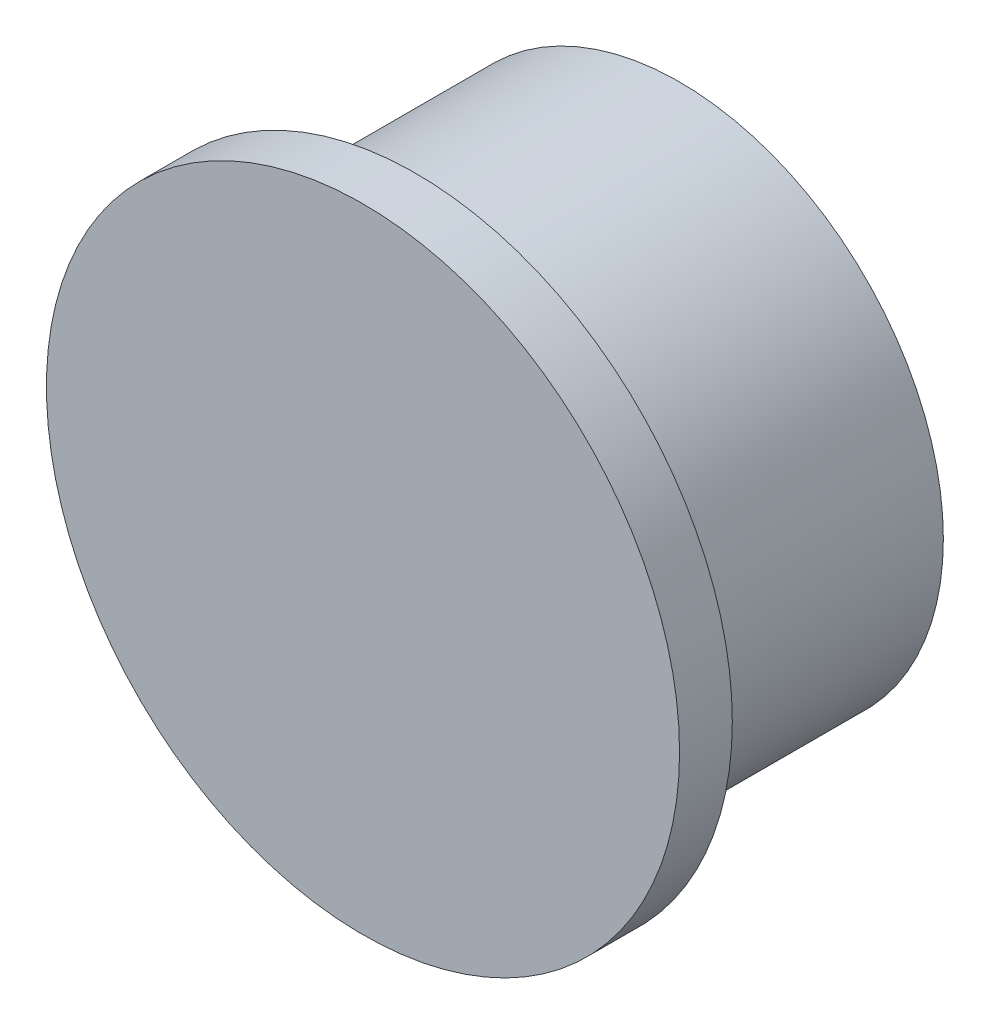
ISO-10303-21;
HEADER;
FILE_DESCRIPTION(('STEP AP214'),'2;1');
FILE_NAME('part.step','',(''),(''),'','','');
FILE_SCHEMA(('AUTOMOTIVE_DESIGN { 1 0 10303 214 1 1 1 1 }'));
ENDSEC;
DATA;
#1=APPLICATION_CONTEXT('core data for automotive mechanical design processes');
#2=APPLICATION_PROTOCOL_DEFINITION('international standard','automotive_design',2000,#1);
#3=PRODUCT_CONTEXT('',#1,'mechanical');
#4=PRODUCT('Part','Part','',(#3));
#5=PRODUCT_RELATED_PRODUCT_CATEGORY('part','',(#4));
#6=PRODUCT_DEFINITION_FORMATION('','',#4);
#7=PRODUCT_DEFINITION_CONTEXT('part definition',#1,'design');
#8=PRODUCT_DEFINITION('design','',#6,#7);
#9=PRODUCT_DEFINITION_SHAPE('','',#8);
#10=(LENGTH_UNIT() NAMED_UNIT(*) SI_UNIT(.MILLI.,.METRE.));
#11=(NAMED_UNIT(*) PLANE_ANGLE_UNIT() SI_UNIT($,.RADIAN.));
#12=(NAMED_UNIT(*) SI_UNIT($,.STERADIAN.) SOLID_ANGLE_UNIT());
#13=UNCERTAINTY_MEASURE_WITH_UNIT(LENGTH_MEASURE(1.E-05),#10,'distance_accuracy_value','');
#14=(GEOMETRIC_REPRESENTATION_CONTEXT(3) GLOBAL_UNCERTAINTY_ASSIGNED_CONTEXT((#13)) GLOBAL_UNIT_ASSIGNED_CONTEXT((#10,
#11,#12)) REPRESENTATION_CONTEXT('',''));
#15=CARTESIAN_POINT('',(0.,0.,0.));
#16=DIRECTION('',(0.,0.,1.));
#17=DIRECTION('',(1.,0.,0.));
#18=AXIS2_PLACEMENT_3D('',#15,#16,#17);
#19=CARTESIAN_POINT('',(-41.1615726148144,8.30698404244554,0.));
#20=DIRECTION('',(0.,0.,1.));
#21=DIRECTION('',(1.,0.,0.));
#22=AXIS2_PLACEMENT_3D('',#19,#20,#21);
#23=PLANE('',#22);
#24=CARTESIAN_POINT('',(-41.1615726148149,-14.1930159575545,0.));
#25=DIRECTION('',(0.,0.,-1.));
#26=DIRECTION('',(-1.,0.,0.));
#27=AXIS2_PLACEMENT_3D('',#24,#25,#26);
#28=CIRCLE('',#27,1.5);
#29=CARTESIAN_POINT('',(-42.6615726148149,-14.1930159575545,0.));
#30=VERTEX_POINT('',#29);
#31=EDGE_CURVE('E72',#30,#30,#28,.T.);
#32=ORIENTED_EDGE('',*,*,#31,.F.);
#33=EDGE_LOOP('',(#32));
#34=FACE_BOUND('',#33,.T.);
#35=CARTESIAN_POINT('',(-18.6615726148147,8.30698404244546,0.));
#36=DIRECTION('',(0.,0.,-1.));
#37=DIRECTION('',(-1.,0.,0.));
#38=AXIS2_PLACEMENT_3D('',#35,#36,#37);
#39=CIRCLE('',#38,1.5);
#40=CARTESIAN_POINT('',(-20.1615726148147,8.30698404244546,0.));
#41=VERTEX_POINT('',#40);
#42=EDGE_CURVE('E69',#41,#41,#39,.T.);
#43=ORIENTED_EDGE('',*,*,#42,.F.);
#44=EDGE_LOOP('',(#43));
#45=FACE_BOUND('',#44,.T.);
#46=CARTESIAN_POINT('',(-41.1615726148144,30.8069840424455,0.));
#47=DIRECTION('',(0.,0.,-1.));
#48=DIRECTION('',(-1.,0.,0.));
#49=AXIS2_PLACEMENT_3D('',#46,#47,#48);
#50=CIRCLE('',#49,1.5);
#51=CARTESIAN_POINT('',(-42.6615726148144,30.8069840424455,0.));
#52=VERTEX_POINT('',#51);
#53=EDGE_CURVE('E63',#52,#52,#50,.T.);
#54=ORIENTED_EDGE('',*,*,#53,.F.);
#55=EDGE_LOOP('',(#54));
#56=FACE_BOUND('',#55,.T.);
#57=CARTESIAN_POINT('',(-63.6615726148147,8.30698404244577,0.));
#58=DIRECTION('',(0.,0.,-1.));
#59=DIRECTION('',(-1.,0.,0.));
#60=AXIS2_PLACEMENT_3D('',#57,#58,#59);
#61=CIRCLE('',#60,1.5);
#62=CARTESIAN_POINT('',(-65.1615726148147,8.30698404244577,0.));
#63=VERTEX_POINT('',#62);
#64=EDGE_CURVE('E57',#63,#63,#61,.T.);
#65=ORIENTED_EDGE('',*,*,#64,.F.);
#66=EDGE_LOOP('',(#65));
#67=FACE_BOUND('',#66,.T.);
#68=CARTESIAN_POINT('',(-41.1615726148144,8.30698404244554,0.));
#69=DIRECTION('',(0.,0.,1.));
#70=DIRECTION('',(1.,0.,0.));
#71=AXIS2_PLACEMENT_3D('',#68,#69,#70);
#72=CIRCLE('',#71,25.);
#73=CARTESIAN_POINT('',(-16.1615726148144,8.30698404244554,0.));
#74=VERTEX_POINT('',#73);
#75=EDGE_CURVE('E38',#74,#74,#72,.T.);
#76=ORIENTED_EDGE('',*,*,#75,.F.);
#77=EDGE_LOOP('',(#76));
#78=FACE_BOUND('',#77,.T.);
#79=CARTESIAN_POINT('',(-41.1615726148144,8.30698404244554,0.));
#80=DIRECTION('',(0.,0.,1.));
#81=DIRECTION('',(1.,0.,0.));
#82=AXIS2_PLACEMENT_3D('',#79,#80,#81);
#83=CIRCLE('',#82,20.);
#84=CARTESIAN_POINT('',(-21.1615726148144,8.30698404244554,0.));
#85=VERTEX_POINT('',#84);
#86=EDGE_CURVE('E45',#85,#85,#83,.T.);
#87=ORIENTED_EDGE('',*,*,#86,.T.);
#88=EDGE_LOOP('',(#87));
#89=FACE_BOUND('',#88,.T.);
#90=ADVANCED_FACE('F34',(#34,#45,#56,#67,#78,#89),#23,.F.);
#91=CARTESIAN_POINT('',(-41.1615726148144,8.30698404244554,25.));
#92=DIRECTION('',(0.,0.,-1.));
#93=DIRECTION('',(-1.,0.,0.));
#94=AXIS2_PLACEMENT_3D('',#91,#92,#93);
#95=CYLINDRICAL_SURFACE('',#94,25.);
#96=CARTESIAN_POINT('',(-41.1615726148144,8.30698404244554,25.));
#97=DIRECTION('',(0.,0.,1.));
#98=DIRECTION('',(1.,0.,0.));
#99=AXIS2_PLACEMENT_3D('',#96,#97,#98);
#100=CIRCLE('',#99,25.);
#101=CARTESIAN_POINT('',(-16.1615726148144,8.30698404244554,25.));
#102=VERTEX_POINT('',#101);
#103=EDGE_CURVE('E10',#102,#102,#100,.T.);
#104=ORIENTED_EDGE('',*,*,#103,.F.);
#105=EDGE_LOOP('',(#104));
#106=FACE_BOUND('',#105,.T.);
#107=ORIENTED_EDGE('',*,*,#75,.T.);
#108=EDGE_LOOP('',(#107));
#109=FACE_BOUND('',#108,.T.);
#110=ADVANCED_FACE('F36',(#106,#109),#95,.T.);
#111=CARTESIAN_POINT('',(-41.1615726148144,8.30698404244554,25.));
#112=DIRECTION('',(0.,0.,-1.));
#113=DIRECTION('',(-1.,0.,0.));
#114=AXIS2_PLACEMENT_3D('',#111,#112,#113);
#115=CYLINDRICAL_SURFACE('',#114,20.);
#116=CARTESIAN_POINT('',(-41.1615726148144,8.30698404244554,25.));
#117=DIRECTION('',(0.,0.,1.));
#118=DIRECTION('',(1.,0.,0.));
#119=AXIS2_PLACEMENT_3D('',#116,#117,#118);
#120=CIRCLE('',#119,20.);
#121=CARTESIAN_POINT('',(-21.1615726148144,8.30698404244554,25.));
#122=VERTEX_POINT('',#121);
#123=EDGE_CURVE('E50',#122,#122,#120,.T.);
#124=ORIENTED_EDGE('',*,*,#123,.T.);
#125=EDGE_LOOP('',(#124));
#126=FACE_BOUND('',#125,.T.);
#127=ORIENTED_EDGE('',*,*,#86,.F.);
#128=EDGE_LOOP('',(#127));
#129=FACE_BOUND('',#128,.T.);
#130=ADVANCED_FACE('F107',(#126,#129),#115,.F.);
#131=CARTESIAN_POINT('',(-63.6615726148147,8.30698404244577,15.));
#132=DIRECTION('',(0.,0.,-1.));
#133=DIRECTION('',(-1.,0.,0.));
#134=AXIS2_PLACEMENT_3D('',#131,#132,#133);
#135=CYLINDRICAL_SURFACE('',#134,1.5);
#136=CARTESIAN_POINT('',(-63.6615726148147,8.30698404244577,15.));
#137=DIRECTION('',(0.,0.,-1.));
#138=DIRECTION('',(-1.,0.,0.));
#139=AXIS2_PLACEMENT_3D('',#136,#137,#138);
#140=CIRCLE('',#139,1.5);
#141=CARTESIAN_POINT('',(-65.1615726148147,8.30698404244577,15.));
#142=VERTEX_POINT('',#141);
#143=EDGE_CURVE('E53',#142,#142,#140,.T.);
#144=CARTESIAN_POINT('',(-65.1615726148147,8.30698404244577,15.));
#145=CARTESIAN_POINT('',(-65.1615726148147,8.30698404244577,14.84375));
#146=CARTESIAN_POINT('',(-65.1615726148147,8.30698404244577,14.6875));
#147=CARTESIAN_POINT('',(-65.1615726148147,8.30698404244577,14.375));
#148=CARTESIAN_POINT('',(-65.1615726148147,8.30698404244577,14.21875));
#149=CARTESIAN_POINT('',(-65.1615726148147,8.30698404244577,13.90625));
#150=CARTESIAN_POINT('',(-65.1615726148147,8.30698404244577,13.75));
#151=CARTESIAN_POINT('',(-65.1615726148147,8.30698404244577,13.4375));
#152=CARTESIAN_POINT('',(-65.1615726148147,8.30698404244577,13.28125));
#153=CARTESIAN_POINT('',(-65.1615726148147,8.30698404244577,12.96875));
#154=CARTESIAN_POINT('',(-65.1615726148147,8.30698404244577,12.8125));
#155=CARTESIAN_POINT('',(-65.1615726148147,8.30698404244577,12.5));
#156=CARTESIAN_POINT('',(-65.1615726148147,8.30698404244577,12.34375));
#157=CARTESIAN_POINT('',(-65.1615726148147,8.30698404244577,12.03125));
#158=CARTESIAN_POINT('',(-65.1615726148147,8.30698404244577,11.875));
#159=CARTESIAN_POINT('',(-65.1615726148147,8.30698404244577,11.5625));
#160=CARTESIAN_POINT('',(-65.1615726148147,8.30698404244577,11.40625));
#161=CARTESIAN_POINT('',(-65.1615726148147,8.30698404244577,11.09375));
#162=CARTESIAN_POINT('',(-65.1615726148147,8.30698404244577,10.9375));
#163=CARTESIAN_POINT('',(-65.1615726148147,8.30698404244577,10.625));
#164=CARTESIAN_POINT('',(-65.1615726148147,8.30698404244577,10.46875));
#165=CARTESIAN_POINT('',(-65.1615726148147,8.30698404244577,10.15625));
#166=CARTESIAN_POINT('',(-65.1615726148147,8.30698404244577,10.));
#167=CARTESIAN_POINT('',(-65.1615726148147,8.30698404244577,9.6875));
#168=CARTESIAN_POINT('',(-65.1615726148147,8.30698404244577,9.53125));
#169=CARTESIAN_POINT('',(-65.1615726148147,8.30698404244577,9.21875));
#170=CARTESIAN_POINT('',(-65.1615726148147,8.30698404244577,9.0625));
#171=CARTESIAN_POINT('',(-65.1615726148147,8.30698404244577,8.75));
#172=CARTESIAN_POINT('',(-65.1615726148147,8.30698404244577,8.59375));
#173=CARTESIAN_POINT('',(-65.1615726148147,8.30698404244577,8.28125));
#174=CARTESIAN_POINT('',(-65.1615726148147,8.30698404244577,8.125));
#175=CARTESIAN_POINT('',(-65.1615726148147,8.30698404244577,7.8125));
#176=CARTESIAN_POINT('',(-65.1615726148147,8.30698404244577,7.65625));
#177=CARTESIAN_POINT('',(-65.1615726148147,8.30698404244577,7.34375));
#178=CARTESIAN_POINT('',(-65.1615726148147,8.30698404244577,7.1875));
#179=CARTESIAN_POINT('',(-65.1615726148147,8.30698404244577,6.875));
#180=CARTESIAN_POINT('',(-65.1615726148147,8.30698404244577,6.71875));
#181=CARTESIAN_POINT('',(-65.1615726148147,8.30698404244577,6.40625));
#182=CARTESIAN_POINT('',(-65.1615726148147,8.30698404244577,6.25));
#183=CARTESIAN_POINT('',(-65.1615726148147,8.30698404244577,5.9375));
#184=CARTESIAN_POINT('',(-65.1615726148147,8.30698404244577,5.78125));
#185=CARTESIAN_POINT('',(-65.1615726148147,8.30698404244577,5.46875));
#186=CARTESIAN_POINT('',(-65.1615726148147,8.30698404244577,5.3125));
#187=CARTESIAN_POINT('',(-65.1615726148147,8.30698404244577,5.));
#188=CARTESIAN_POINT('',(-65.1615726148147,8.30698404244577,4.84375));
#189=CARTESIAN_POINT('',(-65.1615726148147,8.30698404244577,4.53125));
#190=CARTESIAN_POINT('',(-65.1615726148147,8.30698404244577,4.375));
#191=CARTESIAN_POINT('',(-65.1615726148147,8.30698404244577,4.0625));
#192=CARTESIAN_POINT('',(-65.1615726148147,8.30698404244577,3.90625));
#193=CARTESIAN_POINT('',(-65.1615726148147,8.30698404244577,3.59375));
#194=CARTESIAN_POINT('',(-65.1615726148147,8.30698404244577,3.4375));
#195=CARTESIAN_POINT('',(-65.1615726148147,8.30698404244577,3.125));
#196=CARTESIAN_POINT('',(-65.1615726148147,8.30698404244577,2.96875));
#197=CARTESIAN_POINT('',(-65.1615726148147,8.30698404244577,2.65625));
#198=CARTESIAN_POINT('',(-65.1615726148147,8.30698404244577,2.5));
#199=CARTESIAN_POINT('',(-65.1615726148147,8.30698404244577,2.1875));
#200=CARTESIAN_POINT('',(-65.1615726148147,8.30698404244577,2.03125));
#201=CARTESIAN_POINT('',(-65.1615726148147,8.30698404244577,1.71875));
#202=CARTESIAN_POINT('',(-65.1615726148147,8.30698404244577,1.5625));
#203=CARTESIAN_POINT('',(-65.1615726148147,8.30698404244577,1.25));
#204=CARTESIAN_POINT('',(-65.1615726148147,8.30698404244577,1.09375));
#205=CARTESIAN_POINT('',(-65.1615726148147,8.30698404244577,0.781250000000001));
#206=CARTESIAN_POINT('',(-65.1615726148147,8.30698404244577,0.625));
#207=CARTESIAN_POINT('',(-65.1615726148147,8.30698404244577,0.3125));
#208=CARTESIAN_POINT('',(-65.1615726148147,8.30698404244577,0.15625));
#209=CARTESIAN_POINT('',(-65.1615726148147,8.30698404244577,0.));
#210=B_SPLINE_CURVE_WITH_KNOTS('',3,(#144,#145,#146,#147,#148,#149,#150,#151,#152,#153,#154,
#155,#156,#157,#158,#159,#160,#161,#162,#163,#164,#165,#166,#167,#168,#169,#170,#171,#172,#173,
#174,#175,#176,#177,#178,#179,#180,#181,#182,#183,#184,#185,#186,#187,#188,#189,#190,#191,#192,
#193,#194,#195,#196,#197,#198,#199,#200,#201,#202,#203,#204,#205,#206,#207,#208,#209),
.UNSPECIFIED.,.F.,.F.,(4,2,2,2,2,2,2,2,2,2,2,2,2,2,2,2,2,2,2,2,2,2,2,2,2,2,2,2,2,2,2,2,4),(0.,
0.46875,0.937500000000001,1.40625,1.875,2.34375,2.8125,3.28125,3.75,4.21875,4.6875,5.15625,
5.625,6.09375,6.5625,7.03125,7.5,7.96875,8.4375,8.90625,9.375,9.84375,10.3125,10.78125,11.25,
11.71875,12.1875,12.65625,13.125,13.59375,14.0625,14.53125,15.),.UNSPECIFIED.);
#211=EDGE_CURVE('BSEAM114',#142,#63,#210,.T.);
#212=ORIENTED_EDGE('',*,*,#143,.F.);
#213=ORIENTED_EDGE('',*,*,#64,.T.);
#214=ORIENTED_EDGE('',*,*,#211,.T.);
#215=ORIENTED_EDGE('',*,*,#211,.F.);
#216=EDGE_LOOP('',(#212,#214,#213,#215));
#217=FACE_BOUND('',#216,.T.);
#218=ADVANCED_FACE('F114',(#217),#135,.F.);
#219=CARTESIAN_POINT('',(-63.6615726148147,8.30698404244577,15.));
#220=DIRECTION('',(0.,0.,-1.));
#221=DIRECTION('',(-1.,0.,0.));
#222=AXIS2_PLACEMENT_3D('',#219,#220,#221);
#223=PLANE('',#222);
#224=ORIENTED_EDGE('',*,*,#143,.T.);
#225=EDGE_LOOP('',(#224));
#226=FACE_BOUND('',#225,.T.);
#227=ADVANCED_FACE('F116',(#226),#223,.T.);
#228=CARTESIAN_POINT('',(-41.1615726148144,30.8069840424455,15.));
#229=DIRECTION('',(0.,0.,-1.));
#230=DIRECTION('',(-1.,0.,0.));
#231=AXIS2_PLACEMENT_3D('',#228,#229,#230);
#232=CYLINDRICAL_SURFACE('',#231,1.5);
#233=CARTESIAN_POINT('',(-41.1615726148144,30.8069840424455,15.));
#234=DIRECTION('',(0.,0.,-1.));
#235=DIRECTION('',(-1.,0.,0.));
#236=AXIS2_PLACEMENT_3D('',#233,#234,#235);
#237=CIRCLE('',#236,1.5);
#238=CARTESIAN_POINT('',(-42.6615726148144,30.8069840424455,15.));
#239=VERTEX_POINT('',#238);
#240=EDGE_CURVE('E60',#239,#239,#237,.T.);
#241=CARTESIAN_POINT('',(-42.6615726148144,30.8069840424455,15.));
#242=CARTESIAN_POINT('',(-42.6615726148144,30.8069840424455,14.84375));
#243=CARTESIAN_POINT('',(-42.6615726148144,30.8069840424455,14.6875));
#244=CARTESIAN_POINT('',(-42.6615726148144,30.8069840424455,14.375));
#245=CARTESIAN_POINT('',(-42.6615726148144,30.8069840424455,14.21875));
#246=CARTESIAN_POINT('',(-42.6615726148144,30.8069840424455,13.90625));
#247=CARTESIAN_POINT('',(-42.6615726148144,30.8069840424455,13.75));
#248=CARTESIAN_POINT('',(-42.6615726148144,30.8069840424455,13.4375));
#249=CARTESIAN_POINT('',(-42.6615726148144,30.8069840424455,13.28125));
#250=CARTESIAN_POINT('',(-42.6615726148144,30.8069840424455,12.96875));
#251=CARTESIAN_POINT('',(-42.6615726148144,30.8069840424455,12.8125));
#252=CARTESIAN_POINT('',(-42.6615726148144,30.8069840424455,12.5));
#253=CARTESIAN_POINT('',(-42.6615726148144,30.8069840424455,12.34375));
#254=CARTESIAN_POINT('',(-42.6615726148144,30.8069840424455,12.03125));
#255=CARTESIAN_POINT('',(-42.6615726148144,30.8069840424455,11.875));
#256=CARTESIAN_POINT('',(-42.6615726148144,30.8069840424455,11.5625));
#257=CARTESIAN_POINT('',(-42.6615726148144,30.8069840424455,11.40625));
#258=CARTESIAN_POINT('',(-42.6615726148144,30.8069840424455,11.09375));
#259=CARTESIAN_POINT('',(-42.6615726148144,30.8069840424455,10.9375));
#260=CARTESIAN_POINT('',(-42.6615726148144,30.8069840424455,10.625));
#261=CARTESIAN_POINT('',(-42.6615726148144,30.8069840424455,10.46875));
#262=CARTESIAN_POINT('',(-42.6615726148144,30.8069840424455,10.15625));
#263=CARTESIAN_POINT('',(-42.6615726148144,30.8069840424455,10.));
#264=CARTESIAN_POINT('',(-42.6615726148144,30.8069840424455,9.6875));
#265=CARTESIAN_POINT('',(-42.6615726148144,30.8069840424455,9.53125));
#266=CARTESIAN_POINT('',(-42.6615726148144,30.8069840424455,9.21875));
#267=CARTESIAN_POINT('',(-42.6615726148144,30.8069840424455,9.0625));
#268=CARTESIAN_POINT('',(-42.6615726148144,30.8069840424455,8.75));
#269=CARTESIAN_POINT('',(-42.6615726148144,30.8069840424455,8.59375));
#270=CARTESIAN_POINT('',(-42.6615726148144,30.8069840424455,8.28125));
#271=CARTESIAN_POINT('',(-42.6615726148144,30.8069840424455,8.125));
#272=CARTESIAN_POINT('',(-42.6615726148144,30.8069840424455,7.8125));
#273=CARTESIAN_POINT('',(-42.6615726148144,30.8069840424455,7.65625));
#274=CARTESIAN_POINT('',(-42.6615726148144,30.8069840424455,7.34375));
#275=CARTESIAN_POINT('',(-42.6615726148144,30.8069840424455,7.1875));
#276=CARTESIAN_POINT('',(-42.6615726148144,30.8069840424455,6.875));
#277=CARTESIAN_POINT('',(-42.6615726148144,30.8069840424455,6.71875));
#278=CARTESIAN_POINT('',(-42.6615726148144,30.8069840424455,6.40625));
#279=CARTESIAN_POINT('',(-42.6615726148144,30.8069840424455,6.25));
#280=CARTESIAN_POINT('',(-42.6615726148144,30.8069840424455,5.9375));
#281=CARTESIAN_POINT('',(-42.6615726148144,30.8069840424455,5.78125));
#282=CARTESIAN_POINT('',(-42.6615726148144,30.8069840424455,5.46875));
#283=CARTESIAN_POINT('',(-42.6615726148144,30.8069840424455,5.3125));
#284=CARTESIAN_POINT('',(-42.6615726148144,30.8069840424455,5.));
#285=CARTESIAN_POINT('',(-42.6615726148144,30.8069840424455,4.84375));
#286=CARTESIAN_POINT('',(-42.6615726148144,30.8069840424455,4.53125));
#287=CARTESIAN_POINT('',(-42.6615726148144,30.8069840424455,4.375));
#288=CARTESIAN_POINT('',(-42.6615726148144,30.8069840424455,4.0625));
#289=CARTESIAN_POINT('',(-42.6615726148144,30.8069840424455,3.90625));
#290=CARTESIAN_POINT('',(-42.6615726148144,30.8069840424455,3.59375));
#291=CARTESIAN_POINT('',(-42.6615726148144,30.8069840424455,3.4375));
#292=CARTESIAN_POINT('',(-42.6615726148144,30.8069840424455,3.125));
#293=CARTESIAN_POINT('',(-42.6615726148144,30.8069840424455,2.96875));
#294=CARTESIAN_POINT('',(-42.6615726148144,30.8069840424455,2.65625));
#295=CARTESIAN_POINT('',(-42.6615726148144,30.8069840424455,2.5));
#296=CARTESIAN_POINT('',(-42.6615726148144,30.8069840424455,2.1875));
#297=CARTESIAN_POINT('',(-42.6615726148144,30.8069840424455,2.03125));
#298=CARTESIAN_POINT('',(-42.6615726148144,30.8069840424455,1.71875));
#299=CARTESIAN_POINT('',(-42.6615726148144,30.8069840424455,1.5625));
#300=CARTESIAN_POINT('',(-42.6615726148144,30.8069840424455,1.25));
#301=CARTESIAN_POINT('',(-42.6615726148144,30.8069840424455,1.09375));
#302=CARTESIAN_POINT('',(-42.6615726148144,30.8069840424455,0.781250000000001));
#303=CARTESIAN_POINT('',(-42.6615726148144,30.8069840424455,0.625));
#304=CARTESIAN_POINT('',(-42.6615726148144,30.8069840424455,0.3125));
#305=CARTESIAN_POINT('',(-42.6615726148144,30.8069840424455,0.15625));
#306=CARTESIAN_POINT('',(-42.6615726148144,30.8069840424455,0.));
#307=B_SPLINE_CURVE_WITH_KNOTS('',3,(#241,#242,#243,#244,#245,#246,#247,#248,#249,#250,#251,
#252,#253,#254,#255,#256,#257,#258,#259,#260,#261,#262,#263,#264,#265,#266,#267,#268,#269,#270,
#271,#272,#273,#274,#275,#276,#277,#278,#279,#280,#281,#282,#283,#284,#285,#286,#287,#288,#289,
#290,#291,#292,#293,#294,#295,#296,#297,#298,#299,#300,#301,#302,#303,#304,#305,#306),
.UNSPECIFIED.,.F.,.F.,(4,2,2,2,2,2,2,2,2,2,2,2,2,2,2,2,2,2,2,2,2,2,2,2,2,2,2,2,2,2,2,2,4),(0.,
0.46875,0.937500000000001,1.40625,1.875,2.34375,2.8125,3.28125,3.75,4.21875,4.6875,5.15625,
5.625,6.09375,6.5625,7.03125,7.5,7.96875,8.4375,8.90625,9.375,9.84375,10.3125,10.78125,11.25,
11.71875,12.1875,12.65625,13.125,13.59375,14.0625,14.53125,15.),.UNSPECIFIED.);
#308=EDGE_CURVE('BSEAM119',#239,#52,#307,.T.);
#309=ORIENTED_EDGE('',*,*,#240,.F.);
#310=ORIENTED_EDGE('',*,*,#53,.T.);
#311=ORIENTED_EDGE('',*,*,#308,.T.);
#312=ORIENTED_EDGE('',*,*,#308,.F.);
#313=EDGE_LOOP('',(#309,#311,#310,#312));
#314=FACE_BOUND('',#313,.T.);
#315=ADVANCED_FACE('F119',(#314),#232,.F.);
#316=CARTESIAN_POINT('',(-41.1615726148144,30.8069840424455,15.));
#317=DIRECTION('',(0.,0.,-1.));
#318=DIRECTION('',(-1.,0.,0.));
#319=AXIS2_PLACEMENT_3D('',#316,#317,#318);
#320=PLANE('',#319);
#321=ORIENTED_EDGE('',*,*,#240,.T.);
#322=EDGE_LOOP('',(#321));
#323=FACE_BOUND('',#322,.T.);
#324=ADVANCED_FACE('F124',(#323),#320,.T.);
#325=CARTESIAN_POINT('',(-18.6615726148147,8.30698404244546,15.));
#326=DIRECTION('',(0.,0.,-1.));
#327=DIRECTION('',(-1.,0.,0.));
#328=AXIS2_PLACEMENT_3D('',#325,#326,#327);
#329=CYLINDRICAL_SURFACE('',#328,1.5);
#330=CARTESIAN_POINT('',(-18.6615726148147,8.30698404244546,15.));
#331=DIRECTION('',(0.,0.,-1.));
#332=DIRECTION('',(-1.,0.,0.));
#333=AXIS2_PLACEMENT_3D('',#330,#331,#332);
#334=CIRCLE('',#333,1.5);
#335=CARTESIAN_POINT('',(-20.1615726148147,8.30698404244546,15.));
#336=VERTEX_POINT('',#335);
#337=EDGE_CURVE('E66',#336,#336,#334,.T.);
#338=CARTESIAN_POINT('',(-20.1615726148147,8.30698404244546,15.));
#339=CARTESIAN_POINT('',(-20.1615726148147,8.30698404244546,14.84375));
#340=CARTESIAN_POINT('',(-20.1615726148147,8.30698404244546,14.6875));
#341=CARTESIAN_POINT('',(-20.1615726148147,8.30698404244546,14.375));
#342=CARTESIAN_POINT('',(-20.1615726148147,8.30698404244546,14.21875));
#343=CARTESIAN_POINT('',(-20.1615726148147,8.30698404244546,13.90625));
#344=CARTESIAN_POINT('',(-20.1615726148147,8.30698404244546,13.75));
#345=CARTESIAN_POINT('',(-20.1615726148147,8.30698404244546,13.4375));
#346=CARTESIAN_POINT('',(-20.1615726148147,8.30698404244546,13.28125));
#347=CARTESIAN_POINT('',(-20.1615726148147,8.30698404244546,12.96875));
#348=CARTESIAN_POINT('',(-20.1615726148147,8.30698404244546,12.8125));
#349=CARTESIAN_POINT('',(-20.1615726148147,8.30698404244546,12.5));
#350=CARTESIAN_POINT('',(-20.1615726148147,8.30698404244546,12.34375));
#351=CARTESIAN_POINT('',(-20.1615726148147,8.30698404244546,12.03125));
#352=CARTESIAN_POINT('',(-20.1615726148147,8.30698404244546,11.875));
#353=CARTESIAN_POINT('',(-20.1615726148147,8.30698404244546,11.5625));
#354=CARTESIAN_POINT('',(-20.1615726148147,8.30698404244546,11.40625));
#355=CARTESIAN_POINT('',(-20.1615726148147,8.30698404244546,11.09375));
#356=CARTESIAN_POINT('',(-20.1615726148147,8.30698404244546,10.9375));
#357=CARTESIAN_POINT('',(-20.1615726148147,8.30698404244546,10.625));
#358=CARTESIAN_POINT('',(-20.1615726148147,8.30698404244546,10.46875));
#359=CARTESIAN_POINT('',(-20.1615726148147,8.30698404244546,10.15625));
#360=CARTESIAN_POINT('',(-20.1615726148147,8.30698404244546,10.));
#361=CARTESIAN_POINT('',(-20.1615726148147,8.30698404244546,9.6875));
#362=CARTESIAN_POINT('',(-20.1615726148147,8.30698404244546,9.53125));
#363=CARTESIAN_POINT('',(-20.1615726148147,8.30698404244546,9.21875));
#364=CARTESIAN_POINT('',(-20.1615726148147,8.30698404244546,9.0625));
#365=CARTESIAN_POINT('',(-20.1615726148147,8.30698404244546,8.75));
#366=CARTESIAN_POINT('',(-20.1615726148147,8.30698404244546,8.59375));
#367=CARTESIAN_POINT('',(-20.1615726148147,8.30698404244546,8.28125));
#368=CARTESIAN_POINT('',(-20.1615726148147,8.30698404244546,8.125));
#369=CARTESIAN_POINT('',(-20.1615726148147,8.30698404244546,7.8125));
#370=CARTESIAN_POINT('',(-20.1615726148147,8.30698404244546,7.65625));
#371=CARTESIAN_POINT('',(-20.1615726148147,8.30698404244546,7.34375));
#372=CARTESIAN_POINT('',(-20.1615726148147,8.30698404244546,7.1875));
#373=CARTESIAN_POINT('',(-20.1615726148147,8.30698404244546,6.875));
#374=CARTESIAN_POINT('',(-20.1615726148147,8.30698404244546,6.71875));
#375=CARTESIAN_POINT('',(-20.1615726148147,8.30698404244546,6.40625));
#376=CARTESIAN_POINT('',(-20.1615726148147,8.30698404244546,6.25));
#377=CARTESIAN_POINT('',(-20.1615726148147,8.30698404244546,5.9375));
#378=CARTESIAN_POINT('',(-20.1615726148147,8.30698404244546,5.78125));
#379=CARTESIAN_POINT('',(-20.1615726148147,8.30698404244546,5.46875));
#380=CARTESIAN_POINT('',(-20.1615726148147,8.30698404244546,5.3125));
#381=CARTESIAN_POINT('',(-20.1615726148147,8.30698404244546,5.));
#382=CARTESIAN_POINT('',(-20.1615726148147,8.30698404244546,4.84375));
#383=CARTESIAN_POINT('',(-20.1615726148147,8.30698404244546,4.53125));
#384=CARTESIAN_POINT('',(-20.1615726148147,8.30698404244546,4.375));
#385=CARTESIAN_POINT('',(-20.1615726148147,8.30698404244546,4.0625));
#386=CARTESIAN_POINT('',(-20.1615726148147,8.30698404244546,3.90625));
#387=CARTESIAN_POINT('',(-20.1615726148147,8.30698404244546,3.59375));
#388=CARTESIAN_POINT('',(-20.1615726148147,8.30698404244546,3.4375));
#389=CARTESIAN_POINT('',(-20.1615726148147,8.30698404244546,3.125));
#390=CARTESIAN_POINT('',(-20.1615726148147,8.30698404244546,2.96875));
#391=CARTESIAN_POINT('',(-20.1615726148147,8.30698404244546,2.65625));
#392=CARTESIAN_POINT('',(-20.1615726148147,8.30698404244546,2.5));
#393=CARTESIAN_POINT('',(-20.1615726148147,8.30698404244546,2.1875));
#394=CARTESIAN_POINT('',(-20.1615726148147,8.30698404244546,2.03125));
#395=CARTESIAN_POINT('',(-20.1615726148147,8.30698404244546,1.71875));
#396=CARTESIAN_POINT('',(-20.1615726148147,8.30698404244546,1.5625));
#397=CARTESIAN_POINT('',(-20.1615726148147,8.30698404244546,1.25));
#398=CARTESIAN_POINT('',(-20.1615726148147,8.30698404244546,1.09375));
#399=CARTESIAN_POINT('',(-20.1615726148147,8.30698404244546,0.781250000000001));
#400=CARTESIAN_POINT('',(-20.1615726148147,8.30698404244546,0.625));
#401=CARTESIAN_POINT('',(-20.1615726148147,8.30698404244546,0.3125));
#402=CARTESIAN_POINT('',(-20.1615726148147,8.30698404244546,0.15625));
#403=CARTESIAN_POINT('',(-20.1615726148147,8.30698404244546,0.));
#404=B_SPLINE_CURVE_WITH_KNOTS('',3,(#338,#339,#340,#341,#342,#343,#344,#345,#346,#347,#348,
#349,#350,#351,#352,#353,#354,#355,#356,#357,#358,#359,#360,#361,#362,#363,#364,#365,#366,#367,
#368,#369,#370,#371,#372,#373,#374,#375,#376,#377,#378,#379,#380,#381,#382,#383,#384,#385,#386,
#387,#388,#389,#390,#391,#392,#393,#394,#395,#396,#397,#398,#399,#400,#401,#402,#403),
.UNSPECIFIED.,.F.,.F.,(4,2,2,2,2,2,2,2,2,2,2,2,2,2,2,2,2,2,2,2,2,2,2,2,2,2,2,2,2,2,2,2,4),(0.,
0.46875,0.937500000000001,1.40625,1.875,2.34375,2.8125,3.28125,3.75,4.21875,4.6875,5.15625,
5.625,6.09375,6.5625,7.03125,7.5,7.96875,8.4375,8.90625,9.375,9.84375,10.3125,10.78125,11.25,
11.71875,12.1875,12.65625,13.125,13.59375,14.0625,14.53125,15.),.UNSPECIFIED.);
#405=EDGE_CURVE('BSEAM127',#336,#41,#404,.T.);
#406=ORIENTED_EDGE('',*,*,#337,.F.);
#407=ORIENTED_EDGE('',*,*,#42,.T.);
#408=ORIENTED_EDGE('',*,*,#405,.T.);
#409=ORIENTED_EDGE('',*,*,#405,.F.);
#410=EDGE_LOOP('',(#406,#408,#407,#409));
#411=FACE_BOUND('',#410,.T.);
#412=ADVANCED_FACE('F127',(#411),#329,.F.);
#413=CARTESIAN_POINT('',(-18.6615726148147,8.30698404244546,15.));
#414=DIRECTION('',(0.,0.,-1.));
#415=DIRECTION('',(-1.,0.,0.));
#416=AXIS2_PLACEMENT_3D('',#413,#414,#415);
#417=PLANE('',#416);
#418=ORIENTED_EDGE('',*,*,#337,.T.);
#419=EDGE_LOOP('',(#418));
#420=FACE_BOUND('',#419,.T.);
#421=ADVANCED_FACE('F132',(#420),#417,.T.);
#422=CARTESIAN_POINT('',(-41.1615726148149,-14.1930159575545,15.));
#423=DIRECTION('',(0.,0.,-1.));
#424=DIRECTION('',(-1.,0.,0.));
#425=AXIS2_PLACEMENT_3D('',#422,#423,#424);
#426=CYLINDRICAL_SURFACE('',#425,1.5);
#427=CARTESIAN_POINT('',(-41.1615726148149,-14.1930159575545,15.));
#428=DIRECTION('',(0.,0.,-1.));
#429=DIRECTION('',(-1.,0.,0.));
#430=AXIS2_PLACEMENT_3D('',#427,#428,#429);
#431=CIRCLE('',#430,1.5);
#432=CARTESIAN_POINT('',(-42.6615726148149,-14.1930159575545,15.));
#433=VERTEX_POINT('',#432);
#434=EDGE_CURVE('E49',#433,#433,#431,.T.);
#435=CARTESIAN_POINT('',(-42.6615726148149,-14.1930159575545,15.));
#436=CARTESIAN_POINT('',(-42.6615726148149,-14.1930159575545,14.84375));
#437=CARTESIAN_POINT('',(-42.6615726148149,-14.1930159575545,14.6875));
#438=CARTESIAN_POINT('',(-42.6615726148149,-14.1930159575545,14.375));
#439=CARTESIAN_POINT('',(-42.6615726148149,-14.1930159575545,14.21875));
#440=CARTESIAN_POINT('',(-42.6615726148149,-14.1930159575545,13.90625));
#441=CARTESIAN_POINT('',(-42.6615726148149,-14.1930159575545,13.75));
#442=CARTESIAN_POINT('',(-42.6615726148149,-14.1930159575545,13.4375));
#443=CARTESIAN_POINT('',(-42.6615726148149,-14.1930159575545,13.28125));
#444=CARTESIAN_POINT('',(-42.6615726148149,-14.1930159575545,12.96875));
#445=CARTESIAN_POINT('',(-42.6615726148149,-14.1930159575545,12.8125));
#446=CARTESIAN_POINT('',(-42.6615726148149,-14.1930159575545,12.5));
#447=CARTESIAN_POINT('',(-42.6615726148149,-14.1930159575545,12.34375));
#448=CARTESIAN_POINT('',(-42.6615726148149,-14.1930159575545,12.03125));
#449=CARTESIAN_POINT('',(-42.6615726148149,-14.1930159575545,11.875));
#450=CARTESIAN_POINT('',(-42.6615726148149,-14.1930159575545,11.5625));
#451=CARTESIAN_POINT('',(-42.6615726148149,-14.1930159575545,11.40625));
#452=CARTESIAN_POINT('',(-42.6615726148149,-14.1930159575545,11.09375));
#453=CARTESIAN_POINT('',(-42.6615726148149,-14.1930159575545,10.9375));
#454=CARTESIAN_POINT('',(-42.6615726148149,-14.1930159575545,10.625));
#455=CARTESIAN_POINT('',(-42.6615726148149,-14.1930159575545,10.46875));
#456=CARTESIAN_POINT('',(-42.6615726148149,-14.1930159575545,10.15625));
#457=CARTESIAN_POINT('',(-42.6615726148149,-14.1930159575545,10.));
#458=CARTESIAN_POINT('',(-42.6615726148149,-14.1930159575545,9.6875));
#459=CARTESIAN_POINT('',(-42.6615726148149,-14.1930159575545,9.53125));
#460=CARTESIAN_POINT('',(-42.6615726148149,-14.1930159575545,9.21875));
#461=CARTESIAN_POINT('',(-42.6615726148149,-14.1930159575545,9.0625));
#462=CARTESIAN_POINT('',(-42.6615726148149,-14.1930159575545,8.75));
#463=CARTESIAN_POINT('',(-42.6615726148149,-14.1930159575545,8.59375));
#464=CARTESIAN_POINT('',(-42.6615726148149,-14.1930159575545,8.28125));
#465=CARTESIAN_POINT('',(-42.6615726148149,-14.1930159575545,8.125));
#466=CARTESIAN_POINT('',(-42.6615726148149,-14.1930159575545,7.8125));
#467=CARTESIAN_POINT('',(-42.6615726148149,-14.1930159575545,7.65625));
#468=CARTESIAN_POINT('',(-42.6615726148149,-14.1930159575545,7.34375));
#469=CARTESIAN_POINT('',(-42.6615726148149,-14.1930159575545,7.1875));
#470=CARTESIAN_POINT('',(-42.6615726148149,-14.1930159575545,6.875));
#471=CARTESIAN_POINT('',(-42.6615726148149,-14.1930159575545,6.71875));
#472=CARTESIAN_POINT('',(-42.6615726148149,-14.1930159575545,6.40625));
#473=CARTESIAN_POINT('',(-42.6615726148149,-14.1930159575545,6.25));
#474=CARTESIAN_POINT('',(-42.6615726148149,-14.1930159575545,5.9375));
#475=CARTESIAN_POINT('',(-42.6615726148149,-14.1930159575545,5.78125));
#476=CARTESIAN_POINT('',(-42.6615726148149,-14.1930159575545,5.46875));
#477=CARTESIAN_POINT('',(-42.6615726148149,-14.1930159575545,5.3125));
#478=CARTESIAN_POINT('',(-42.6615726148149,-14.1930159575545,5.));
#479=CARTESIAN_POINT('',(-42.6615726148149,-14.1930159575545,4.84375));
#480=CARTESIAN_POINT('',(-42.6615726148149,-14.1930159575545,4.53125));
#481=CARTESIAN_POINT('',(-42.6615726148149,-14.1930159575545,4.375));
#482=CARTESIAN_POINT('',(-42.6615726148149,-14.1930159575545,4.0625));
#483=CARTESIAN_POINT('',(-42.6615726148149,-14.1930159575545,3.90625));
#484=CARTESIAN_POINT('',(-42.6615726148149,-14.1930159575545,3.59375));
#485=CARTESIAN_POINT('',(-42.6615726148149,-14.1930159575545,3.4375));
#486=CARTESIAN_POINT('',(-42.6615726148149,-14.1930159575545,3.125));
#487=CARTESIAN_POINT('',(-42.6615726148149,-14.1930159575545,2.96875));
#488=CARTESIAN_POINT('',(-42.6615726148149,-14.1930159575545,2.65625));
#489=CARTESIAN_POINT('',(-42.6615726148149,-14.1930159575545,2.5));
#490=CARTESIAN_POINT('',(-42.6615726148149,-14.1930159575545,2.1875));
#491=CARTESIAN_POINT('',(-42.6615726148149,-14.1930159575545,2.03125));
#492=CARTESIAN_POINT('',(-42.6615726148149,-14.1930159575545,1.71875));
#493=CARTESIAN_POINT('',(-42.6615726148149,-14.1930159575545,1.5625));
#494=CARTESIAN_POINT('',(-42.6615726148149,-14.1930159575545,1.25));
#495=CARTESIAN_POINT('',(-42.6615726148149,-14.1930159575545,1.09375));
#496=CARTESIAN_POINT('',(-42.6615726148149,-14.1930159575545,0.781250000000001));
#497=CARTESIAN_POINT('',(-42.6615726148149,-14.1930159575545,0.625));
#498=CARTESIAN_POINT('',(-42.6615726148149,-14.1930159575545,0.3125));
#499=CARTESIAN_POINT('',(-42.6615726148149,-14.1930159575545,0.15625));
#500=CARTESIAN_POINT('',(-42.6615726148149,-14.1930159575545,0.));
#501=B_SPLINE_CURVE_WITH_KNOTS('',3,(#435,#436,#437,#438,#439,#440,#441,#442,#443,#444,#445,
#446,#447,#448,#449,#450,#451,#452,#453,#454,#455,#456,#457,#458,#459,#460,#461,#462,#463,#464,
#465,#466,#467,#468,#469,#470,#471,#472,#473,#474,#475,#476,#477,#478,#479,#480,#481,#482,#483,
#484,#485,#486,#487,#488,#489,#490,#491,#492,#493,#494,#495,#496,#497,#498,#499,#500),
.UNSPECIFIED.,.F.,.F.,(4,2,2,2,2,2,2,2,2,2,2,2,2,2,2,2,2,2,2,2,2,2,2,2,2,2,2,2,2,2,2,2,4),(0.,
0.46875,0.937500000000001,1.40625,1.875,2.34375,2.8125,3.28125,3.75,4.21875,4.6875,5.15625,
5.625,6.09375,6.5625,7.03125,7.5,7.96875,8.4375,8.90625,9.375,9.84375,10.3125,10.78125,11.25,
11.71875,12.1875,12.65625,13.125,13.59375,14.0625,14.53125,15.),.UNSPECIFIED.);
#502=EDGE_CURVE('BSEAM135',#433,#30,#501,.T.);
#503=ORIENTED_EDGE('',*,*,#434,.F.);
#504=ORIENTED_EDGE('',*,*,#31,.T.);
#505=ORIENTED_EDGE('',*,*,#502,.T.);
#506=ORIENTED_EDGE('',*,*,#502,.F.);
#507=EDGE_LOOP('',(#503,#505,#504,#506));
#508=FACE_BOUND('',#507,.T.);
#509=ADVANCED_FACE('F135',(#508),#426,.F.);
#510=CARTESIAN_POINT('',(-41.1615726148149,-14.1930159575545,15.));
#511=DIRECTION('',(0.,0.,-1.));
#512=DIRECTION('',(-1.,0.,0.));
#513=AXIS2_PLACEMENT_3D('',#510,#511,#512);
#514=PLANE('',#513);
#515=ORIENTED_EDGE('',*,*,#434,.T.);
#516=EDGE_LOOP('',(#515));
#517=FACE_BOUND('',#516,.T.);
#518=ADVANCED_FACE('F100',(#517),#514,.T.);
#519=CARTESIAN_POINT('',(-41.1615726148144,8.30698404244554,25.));
#520=DIRECTION('',(0.,0.,1.));
#521=DIRECTION('',(1.,0.,0.));
#522=AXIS2_PLACEMENT_3D('',#519,#520,#521);
#523=PLANE('',#522);
#524=ORIENTED_EDGE('',*,*,#123,.F.);
#525=EDGE_LOOP('',(#524));
#526=FACE_BOUND('',#525,.T.);
#527=ADVANCED_FACE('F88',(#526),#523,.F.);
#528=CARTESIAN_POINT('',(-41.1615726148144,8.30698404244554,30.));
#529=DIRECTION('',(0.,0.,-1.));
#530=DIRECTION('',(-1.,0.,0.));
#531=AXIS2_PLACEMENT_3D('',#528,#529,#530);
#532=CYLINDRICAL_SURFACE('',#531,30.);
#533=CARTESIAN_POINT('',(-41.1615726148144,8.30698404244554,30.));
#534=DIRECTION('',(0.,0.,1.));
#535=DIRECTION('',(1.,0.,0.));
#536=AXIS2_PLACEMENT_3D('',#533,#534,#535);
#537=CIRCLE('',#536,30.);
#538=CARTESIAN_POINT('',(-11.1615726148144,8.30698404244554,30.));
#539=VERTEX_POINT('',#538);
#540=EDGE_CURVE('E54',#539,#539,#537,.T.);
#541=ORIENTED_EDGE('',*,*,#540,.F.);
#542=EDGE_LOOP('',(#541));
#543=FACE_BOUND('',#542,.T.);
#544=CARTESIAN_POINT('',(-41.1615726148144,8.30698404244554,25.));
#545=DIRECTION('',(0.,0.,1.));
#546=DIRECTION('',(1.,0.,0.));
#547=AXIS2_PLACEMENT_3D('',#544,#545,#546);
#548=CIRCLE('',#547,30.);
#549=CARTESIAN_POINT('',(-11.1615726148144,8.30698404244554,25.));
#550=VERTEX_POINT('',#549);
#551=EDGE_CURVE('E77',#550,#550,#548,.T.);
#552=ORIENTED_EDGE('',*,*,#551,.T.);
#553=EDGE_LOOP('',(#552));
#554=FACE_BOUND('',#553,.T.);
#555=ADVANCED_FACE('F85',(#543,#554),#532,.T.);
#556=CARTESIAN_POINT('',(-41.1615726148144,8.30698404244554,30.));
#557=DIRECTION('',(0.,0.,1.));
#558=DIRECTION('',(1.,0.,0.));
#559=AXIS2_PLACEMENT_3D('',#556,#557,#558);
#560=PLANE('',#559);
#561=ORIENTED_EDGE('',*,*,#540,.T.);
#562=EDGE_LOOP('',(#561));
#563=FACE_BOUND('',#562,.T.);
#564=ADVANCED_FACE('F83',(#563),#560,.T.);
#565=ORIENTED_EDGE('',*,*,#103,.T.);
#566=EDGE_LOOP('',(#565));
#567=FACE_BOUND('',#566,.T.);
#568=ORIENTED_EDGE('',*,*,#551,.F.);
#569=EDGE_LOOP('',(#568));
#570=FACE_BOUND('',#569,.T.);
#571=ADVANCED_FACE('F92',(#567,#570),#523,.F.);
#572=CLOSED_SHELL('',(#90,#110,#130,#218,#227,#315,#324,#412,#421,#509,#518,#527,#555,#564,#571));
#573=MANIFOLD_SOLID_BREP('B2',#572);
#574=ADVANCED_BREP_SHAPE_REPRESENTATION('',(#18,#573),#14);
#575=SHAPE_DEFINITION_REPRESENTATION(#9,#574);
ENDSEC;
END-ISO-10303-21;
